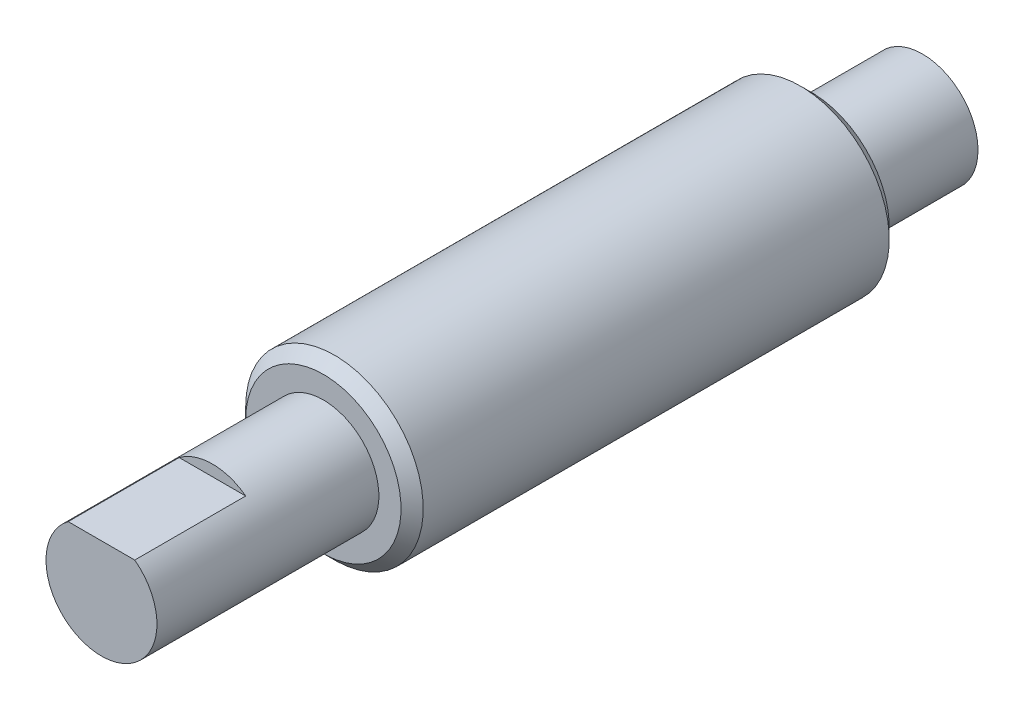
ISO-10303-21;
HEADER;
FILE_DESCRIPTION(('STEP AP214'),'2;1');
FILE_NAME('part.step','',(''),(''),'','','');
FILE_SCHEMA(('AUTOMOTIVE_DESIGN { 1 0 10303 214 1 1 1 1 }'));
ENDSEC;
DATA;
#1=APPLICATION_CONTEXT('core data for automotive mechanical design processes');
#2=APPLICATION_PROTOCOL_DEFINITION('international standard','automotive_design',2000,#1);
#3=PRODUCT_CONTEXT('',#1,'mechanical');
#4=PRODUCT('Part','Part','',(#3));
#5=PRODUCT_RELATED_PRODUCT_CATEGORY('part','',(#4));
#6=PRODUCT_DEFINITION_FORMATION('','',#4);
#7=PRODUCT_DEFINITION_CONTEXT('part definition',#1,'design');
#8=PRODUCT_DEFINITION('design','',#6,#7);
#9=PRODUCT_DEFINITION_SHAPE('','',#8);
#10=(LENGTH_UNIT() NAMED_UNIT(*) SI_UNIT(.MILLI.,.METRE.));
#11=(NAMED_UNIT(*) PLANE_ANGLE_UNIT() SI_UNIT($,.RADIAN.));
#12=(NAMED_UNIT(*) SI_UNIT($,.STERADIAN.) SOLID_ANGLE_UNIT());
#13=UNCERTAINTY_MEASURE_WITH_UNIT(LENGTH_MEASURE(1.E-05),#10,'distance_accuracy_value','');
#14=(GEOMETRIC_REPRESENTATION_CONTEXT(3) GLOBAL_UNCERTAINTY_ASSIGNED_CONTEXT((#13)) GLOBAL_UNIT_ASSIGNED_CONTEXT((#10,
#11,#12)) REPRESENTATION_CONTEXT('',''));
#15=CARTESIAN_POINT('',(0.,0.,0.));
#16=DIRECTION('',(0.,0.,1.));
#17=DIRECTION('',(1.,0.,0.));
#18=AXIS2_PLACEMENT_3D('',#15,#16,#17);
#19=CARTESIAN_POINT('',(0.,0.,-74.));
#20=DIRECTION('',(0.,0.,1.));
#21=DIRECTION('',(1.,0.,0.));
#22=AXIS2_PLACEMENT_3D('',#19,#20,#21);
#23=CONICAL_SURFACE('',#22,5.00000000000001,1.04719755119659);
#24=CARTESIAN_POINT('',(0.,0.,-76.8867513459482));
#25=VERTEX_POINT('',#24);
#26=VERTEX_LOOP('',#25);
#27=FACE_BOUND('',#26,.T.);
#28=CARTESIAN_POINT('',(0.,0.,-74.));
#29=DIRECTION('',(0.,0.,-1.));
#30=DIRECTION('',(-1.,0.,0.));
#31=AXIS2_PLACEMENT_3D('',#28,#29,#30);
#32=CIRCLE('',#31,5.00000000000001);
#33=CARTESIAN_POINT('',(-5.00000000000001,0.,-74.));
#34=VERTEX_POINT('',#33);
#35=EDGE_CURVE('E86',#34,#34,#32,.T.);
#36=ORIENTED_EDGE('',*,*,#35,.T.);
#37=EDGE_LOOP('',(#36));
#38=FACE_BOUND('',#37,.T.);
#39=ADVANCED_FACE('F39',(#27,#38),#23,.T.);
#40=CARTESIAN_POINT('',(0.,0.,0.));
#41=DIRECTION('',(0.,0.,-1.));
#42=DIRECTION('',(-1.,0.,0.));
#43=AXIS2_PLACEMENT_3D('',#40,#41,#42);
#44=PLANE('',#43);
#45=CARTESIAN_POINT('',(0.,0.,0.));
#46=DIRECTION('',(0.,0.,-1.));
#47=DIRECTION('',(-1.,0.,0.));
#48=AXIS2_PLACEMENT_3D('',#45,#46,#47);
#49=CIRCLE('',#48,5.);
#50=CARTESIAN_POINT('',(3.,4.,0.));
#51=VERTEX_POINT('',#50);
#52=CARTESIAN_POINT('',(-3.,4.,0.));
#53=VERTEX_POINT('',#52);
#54=EDGE_CURVE('E11',#51,#53,#49,.T.);
#55=ORIENTED_EDGE('',*,*,#54,.F.);
#56=DIRECTION('',(1.,0.,0.));
#57=VECTOR('',#56,1.);
#58=CARTESIAN_POINT('',(-3.,4.,0.));
#59=LINE('',#58,#57);
#60=EDGE_CURVE('E70',#53,#51,#59,.T.);
#61=ORIENTED_EDGE('',*,*,#60,.F.);
#62=EDGE_LOOP('',(#55,#61));
#63=FACE_BOUND('',#62,.T.);
#64=ADVANCED_FACE('F79',(#63),#44,.F.);
#65=CARTESIAN_POINT('',(0.,0.,-74.));
#66=DIRECTION('',(0.,0.,-1.));
#67=DIRECTION('',(-1.,0.,0.));
#68=AXIS2_PLACEMENT_3D('',#65,#66,#67);
#69=CYLINDRICAL_SURFACE('',#68,5.);
#70=ORIENTED_EDGE('',*,*,#54,.T.);
#71=DIRECTION('',(0.,0.,1.));
#72=VECTOR('',#71,1.);
#73=CARTESIAN_POINT('',(-3.,4.,-10.));
#74=LINE('',#73,#72);
#75=CARTESIAN_POINT('',(-3.,4.,-10.));
#76=VERTEX_POINT('',#75);
#77=EDGE_CURVE('E67',#76,#53,#74,.T.);
#78=ORIENTED_EDGE('',*,*,#77,.F.);
#79=CARTESIAN_POINT('',(0.,0.,-10.));
#80=DIRECTION('',(0.,0.,1.));
#81=DIRECTION('',(1.,0.,0.));
#82=AXIS2_PLACEMENT_3D('',#79,#80,#81);
#83=CIRCLE('',#82,5.);
#84=CARTESIAN_POINT('',(3.,4.,-9.99999999999999));
#85=VERTEX_POINT('',#84);
#86=EDGE_CURVE('E81',#85,#76,#83,.T.);
#87=ORIENTED_EDGE('',*,*,#86,.F.);
#88=DIRECTION('',(0.,0.,1.));
#89=VECTOR('',#88,1.);
#90=CARTESIAN_POINT('',(3.,4.,-10.));
#91=LINE('',#90,#89);
#92=EDGE_CURVE('E75',#85,#51,#91,.T.);
#93=ORIENTED_EDGE('',*,*,#92,.T.);
#94=EDGE_LOOP('',(#70,#78,#87,#93));
#95=FACE_BOUND('',#94,.T.);
#96=CARTESIAN_POINT('',(0.,0.,-20.));
#97=DIRECTION('',(0.,0.,-1.));
#98=DIRECTION('',(-1.,0.,0.));
#99=AXIS2_PLACEMENT_3D('',#96,#97,#98);
#100=CIRCLE('',#99,5.);
#101=CARTESIAN_POINT('',(-5.,0.,-20.));
#102=VERTEX_POINT('',#101);
#103=EDGE_CURVE('E47',#102,#102,#100,.T.);
#104=ORIENTED_EDGE('',*,*,#103,.F.);
#105=EDGE_LOOP('',(#104));
#106=FACE_BOUND('',#105,.T.);
#107=ADVANCED_FACE('F83',(#95,#106),#69,.T.);
#108=CARTESIAN_POINT('',(5.,0.,-20.));
#109=DIRECTION('',(0.,0.,-1.));
#110=DIRECTION('',(-1.,0.,0.));
#111=AXIS2_PLACEMENT_3D('',#108,#109,#110);
#112=PLANE('',#111);
#113=CARTESIAN_POINT('',(0.,0.,-20.));
#114=DIRECTION('',(0.,0.,-1.));
#115=DIRECTION('',(-1.,0.,0.));
#116=AXIS2_PLACEMENT_3D('',#113,#114,#115);
#117=CIRCLE('',#116,7.00000000000001);
#118=CARTESIAN_POINT('',(-7.00000000000001,0.,-20.));
#119=VERTEX_POINT('',#118);
#120=EDGE_CURVE('E109',#119,#119,#117,.T.);
#121=ORIENTED_EDGE('',*,*,#120,.F.);
#122=EDGE_LOOP('',(#121));
#123=FACE_BOUND('',#122,.T.);
#124=ORIENTED_EDGE('',*,*,#103,.T.);
#125=EDGE_LOOP('',(#124));
#126=FACE_BOUND('',#125,.T.);
#127=ADVANCED_FACE('F116',(#123,#126),#112,.F.);
#128=CARTESIAN_POINT('',(0.,0.,-20.));
#129=DIRECTION('',(0.,0.,-1.));
#130=DIRECTION('',(-1.,0.,0.));
#131=AXIS2_PLACEMENT_3D('',#128,#129,#130);
#132=CONICAL_SURFACE('',#131,7.00000000000001,0.785398163397448);
#133=CARTESIAN_POINT('',(0.,0.,-21.));
#134=DIRECTION('',(0.,0.,-1.));
#135=DIRECTION('',(-1.,0.,0.));
#136=AXIS2_PLACEMENT_3D('',#133,#134,#135);
#137=CIRCLE('',#136,8.00000000000001);
#138=CARTESIAN_POINT('',(-8.00000000000001,0.,-21.));
#139=VERTEX_POINT('',#138);
#140=EDGE_CURVE('E105',#139,#139,#137,.T.);
#141=ORIENTED_EDGE('',*,*,#140,.F.);
#142=EDGE_LOOP('',(#141));
#143=FACE_BOUND('',#142,.T.);
#144=ORIENTED_EDGE('',*,*,#120,.T.);
#145=EDGE_LOOP('',(#144));
#146=FACE_BOUND('',#145,.T.);
#147=ADVANCED_FACE('F123',(#143,#146),#132,.T.);
#148=CARTESIAN_POINT('',(0.,0.,-74.));
#149=DIRECTION('',(0.,0.,-1.));
#150=DIRECTION('',(-1.,0.,0.));
#151=AXIS2_PLACEMENT_3D('',#148,#149,#150);
#152=CYLINDRICAL_SURFACE('',#151,8.00000000000001);
#153=CARTESIAN_POINT('',(0.,0.,-63.));
#154=DIRECTION('',(0.,0.,-1.));
#155=DIRECTION('',(-1.,0.,0.));
#156=AXIS2_PLACEMENT_3D('',#153,#154,#155);
#157=CIRCLE('',#156,8.00000000000001);
#158=CARTESIAN_POINT('',(-8.00000000000002,0.,-63.));
#159=VERTEX_POINT('',#158);
#160=EDGE_CURVE('E101',#159,#159,#157,.T.);
#161=ORIENTED_EDGE('',*,*,#160,.F.);
#162=EDGE_LOOP('',(#161));
#163=FACE_BOUND('',#162,.T.);
#164=ORIENTED_EDGE('',*,*,#140,.T.);
#165=EDGE_LOOP('',(#164));
#166=FACE_BOUND('',#165,.T.);
#167=ADVANCED_FACE('F147',(#163,#166),#152,.T.);
#168=CARTESIAN_POINT('',(0.,0.,-63.));
#169=DIRECTION('',(0.,0.,1.));
#170=DIRECTION('',(1.,0.,0.));
#171=AXIS2_PLACEMENT_3D('',#168,#169,#170);
#172=CONICAL_SURFACE('',#171,8.00000000000001,0.785398163397449);
#173=CARTESIAN_POINT('',(0.,0.,-64.));
#174=DIRECTION('',(0.,0.,-1.));
#175=DIRECTION('',(-1.,0.,0.));
#176=AXIS2_PLACEMENT_3D('',#173,#174,#175);
#177=CIRCLE('',#176,7.00000000000001);
#178=CARTESIAN_POINT('',(-7.00000000000001,0.,-64.));
#179=VERTEX_POINT('',#178);
#180=EDGE_CURVE('E97',#179,#179,#177,.T.);
#181=ORIENTED_EDGE('',*,*,#180,.F.);
#182=EDGE_LOOP('',(#181));
#183=FACE_BOUND('',#182,.T.);
#184=ORIENTED_EDGE('',*,*,#160,.T.);
#185=EDGE_LOOP('',(#184));
#186=FACE_BOUND('',#185,.T.);
#187=ADVANCED_FACE('F141',(#183,#186),#172,.T.);
#188=CARTESIAN_POINT('',(7.00000000000001,0.,-64.));
#189=DIRECTION('',(0.,0.,1.));
#190=DIRECTION('',(1.,0.,0.));
#191=AXIS2_PLACEMENT_3D('',#188,#189,#190);
#192=PLANE('',#191);
#193=CARTESIAN_POINT('',(0.,0.,-64.));
#194=DIRECTION('',(0.,0.,-1.));
#195=DIRECTION('',(-1.,0.,0.));
#196=AXIS2_PLACEMENT_3D('',#193,#194,#195);
#197=CIRCLE('',#196,5.);
#198=CARTESIAN_POINT('',(-5.00000000000001,0.,-64.));
#199=VERTEX_POINT('',#198);
#200=EDGE_CURVE('E90',#199,#199,#197,.T.);
#201=ORIENTED_EDGE('',*,*,#200,.F.);
#202=EDGE_LOOP('',(#201));
#203=FACE_BOUND('',#202,.T.);
#204=ORIENTED_EDGE('',*,*,#180,.T.);
#205=EDGE_LOOP('',(#204));
#206=FACE_BOUND('',#205,.T.);
#207=ADVANCED_FACE('F135',(#203,#206),#192,.F.);
#208=CARTESIAN_POINT('',(0.,0.,-74.));
#209=DIRECTION('',(0.,0.,-1.));
#210=DIRECTION('',(-1.,0.,0.));
#211=AXIS2_PLACEMENT_3D('',#208,#209,#210);
#212=CYLINDRICAL_SURFACE('',#211,5.);
#213=ORIENTED_EDGE('',*,*,#35,.F.);
#214=EDGE_LOOP('',(#213));
#215=FACE_BOUND('',#214,.T.);
#216=ORIENTED_EDGE('',*,*,#200,.T.);
#217=EDGE_LOOP('',(#216));
#218=FACE_BOUND('',#217,.T.);
#219=ADVANCED_FACE('F132',(#215,#218),#212,.T.);
#220=CARTESIAN_POINT('',(-3.,4.,-10.));
#221=DIRECTION('',(0.,-1.,0.));
#222=DIRECTION('',(1.,0.,0.));
#223=AXIS2_PLACEMENT_3D('',#220,#221,#222);
#224=PLANE('',#223);
#225=ORIENTED_EDGE('',*,*,#60,.T.);
#226=ORIENTED_EDGE('',*,*,#92,.F.);
#227=DIRECTION('',(1.,0.,0.));
#228=VECTOR('',#227,1.);
#229=CARTESIAN_POINT('',(-3.,4.,-10.));
#230=LINE('',#229,#228);
#231=EDGE_CURVE('E53',#76,#85,#230,.T.);
#232=ORIENTED_EDGE('',*,*,#231,.F.);
#233=ORIENTED_EDGE('',*,*,#77,.T.);
#234=EDGE_LOOP('',(#225,#226,#232,#233));
#235=FACE_BOUND('',#234,.T.);
#236=ADVANCED_FACE('F69',(#235),#224,.F.);
#237=CARTESIAN_POINT('',(0.,0.,-10.));
#238=DIRECTION('',(0.,0.,1.));
#239=DIRECTION('',(1.,0.,0.));
#240=AXIS2_PLACEMENT_3D('',#237,#238,#239);
#241=PLANE('',#240);
#242=ORIENTED_EDGE('',*,*,#86,.T.);
#243=ORIENTED_EDGE('',*,*,#231,.T.);
#244=EDGE_LOOP('',(#242,#243));
#245=FACE_BOUND('',#244,.T.);
#246=ADVANCED_FACE('F165',(#245),#241,.T.);
#247=CLOSED_SHELL('',(#39,#64,#107,#127,#147,#167,#187,#207,#219,#236,#246));
#248=MANIFOLD_SOLID_BREP('B2',#247);
#249=ADVANCED_BREP_SHAPE_REPRESENTATION('',(#18,#248),#14);
#250=SHAPE_DEFINITION_REPRESENTATION(#9,#249);
ENDSEC;
END-ISO-10303-21;
